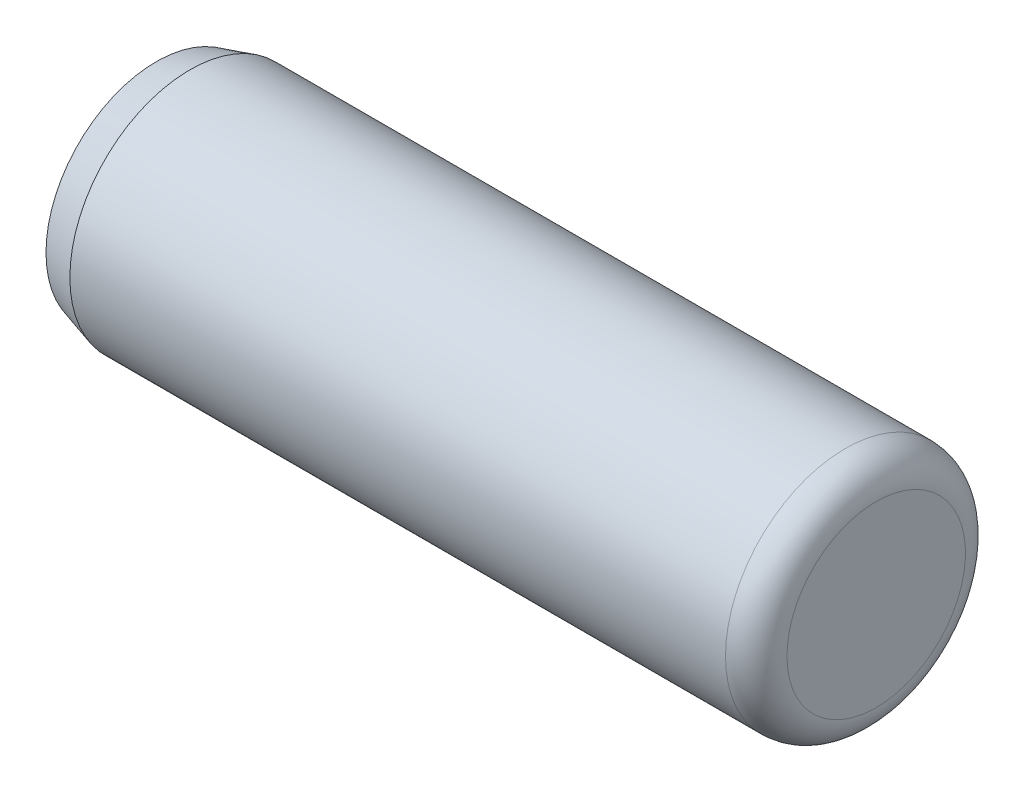
ISO-10303-21;
HEADER;
FILE_DESCRIPTION(('STEP AP214'),'2;1');
FILE_NAME('part.step','',(''),(''),'','','');
FILE_SCHEMA(('AUTOMOTIVE_DESIGN { 1 0 10303 214 1 1 1 1 }'));
ENDSEC;
DATA;
#1=APPLICATION_CONTEXT('core data for automotive mechanical design processes');
#2=APPLICATION_PROTOCOL_DEFINITION('international standard','automotive_design',2000,#1);
#3=PRODUCT_CONTEXT('',#1,'mechanical');
#4=PRODUCT('Part','Part','',(#3));
#5=PRODUCT_RELATED_PRODUCT_CATEGORY('part','',(#4));
#6=PRODUCT_DEFINITION_FORMATION('','',#4);
#7=PRODUCT_DEFINITION_CONTEXT('part definition',#1,'design');
#8=PRODUCT_DEFINITION('design','',#6,#7);
#9=PRODUCT_DEFINITION_SHAPE('','',#8);
#10=(LENGTH_UNIT() NAMED_UNIT(*) SI_UNIT(.MILLI.,.METRE.));
#11=(NAMED_UNIT(*) PLANE_ANGLE_UNIT() SI_UNIT($,.RADIAN.));
#12=(NAMED_UNIT(*) SI_UNIT($,.STERADIAN.) SOLID_ANGLE_UNIT());
#13=UNCERTAINTY_MEASURE_WITH_UNIT(LENGTH_MEASURE(1.E-05),#10,'distance_accuracy_value','');
#14=(GEOMETRIC_REPRESENTATION_CONTEXT(3) GLOBAL_UNCERTAINTY_ASSIGNED_CONTEXT((#13)) GLOBAL_UNIT_ASSIGNED_CONTEXT((#10,
#11,#12)) REPRESENTATION_CONTEXT('',''));
#15=CARTESIAN_POINT('',(0.,0.,0.));
#16=DIRECTION('',(0.,0.,1.));
#17=DIRECTION('',(1.,0.,0.));
#18=AXIS2_PLACEMENT_3D('',#15,#16,#17);
#19=CARTESIAN_POINT('',(4.3561,0.,0.));
#20=DIRECTION('',(-1.,0.,0.));
#21=DIRECTION('',(0.,0.,1.));
#22=AXIS2_PLACEMENT_3D('',#19,#20,#21);
#23=TOROIDAL_SURFACE('',#22,1.1811,0.406400000000001);
#24=CARTESIAN_POINT('',(4.3561,0.,0.));
#25=DIRECTION('',(-1.,0.,0.));
#26=DIRECTION('',(0.,0.,1.));
#27=AXIS2_PLACEMENT_3D('',#24,#25,#26);
#28=CIRCLE('',#27,1.5875);
#29=CARTESIAN_POINT('',(4.3561,0.,1.5875));
#30=VERTEX_POINT('',#29);
#31=EDGE_CURVE('E10',#30,#30,#28,.T.);
#32=ORIENTED_EDGE('',*,*,#31,.F.);
#33=EDGE_LOOP('',(#32));
#34=FACE_BOUND('',#33,.T.);
#35=CARTESIAN_POINT('',(4.7625,0.,0.));
#36=DIRECTION('',(-1.,0.,0.));
#37=DIRECTION('',(0.,0.,1.));
#38=AXIS2_PLACEMENT_3D('',#35,#36,#37);
#39=CIRCLE('',#38,1.1811);
#40=CARTESIAN_POINT('',(4.7625,0.,1.1811));
#41=VERTEX_POINT('',#40);
#42=EDGE_CURVE('E51',#41,#41,#39,.T.);
#43=ORIENTED_EDGE('',*,*,#42,.T.);
#44=EDGE_LOOP('',(#43));
#45=FACE_BOUND('',#44,.T.);
#46=ADVANCED_FACE('F37',(#34,#45),#23,.T.);
#47=CARTESIAN_POINT('',(-4.7625,0.,0.));
#48=DIRECTION('',(-1.,0.,0.));
#49=DIRECTION('',(0.,0.,1.));
#50=AXIS2_PLACEMENT_3D('',#47,#48,#49);
#51=CYLINDRICAL_SURFACE('',#50,1.5875);
#52=CARTESIAN_POINT('',(-4.31959836563221,0.,0.));
#53=DIRECTION('',(-1.,0.,0.));
#54=DIRECTION('',(0.,0.,1.));
#55=AXIS2_PLACEMENT_3D('',#52,#53,#54);
#56=CIRCLE('',#55,1.5875);
#57=CARTESIAN_POINT('',(-4.31959836563221,0.,1.5875));
#58=VERTEX_POINT('',#57);
#59=EDGE_CURVE('E43',#58,#58,#56,.T.);
#60=ORIENTED_EDGE('',*,*,#59,.F.);
#61=EDGE_LOOP('',(#60));
#62=FACE_BOUND('',#61,.T.);
#63=ORIENTED_EDGE('',*,*,#31,.T.);
#64=EDGE_LOOP('',(#63));
#65=FACE_BOUND('',#64,.T.);
#66=ADVANCED_FACE('F69',(#62,#65),#51,.T.);
#67=CARTESIAN_POINT('',(-4.31959836563221,0.,0.));
#68=DIRECTION('',(1.,0.,0.));
#69=DIRECTION('',(0.,0.,-1.));
#70=AXIS2_PLACEMENT_3D('',#67,#68,#69);
#71=CONICAL_SURFACE('',#70,1.5875,0.279252680319095);
#72=CARTESIAN_POINT('',(-4.7625,0.,0.));
#73=DIRECTION('',(-1.,0.,0.));
#74=DIRECTION('',(0.,0.,1.));
#75=AXIS2_PLACEMENT_3D('',#72,#73,#74);
#76=CIRCLE('',#75,1.4605);
#77=CARTESIAN_POINT('',(-4.7625,0.,1.4605));
#78=VERTEX_POINT('',#77);
#79=EDGE_CURVE('E47',#78,#78,#76,.T.);
#80=ORIENTED_EDGE('',*,*,#79,.F.);
#81=EDGE_LOOP('',(#80));
#82=FACE_BOUND('',#81,.T.);
#83=ORIENTED_EDGE('',*,*,#59,.T.);
#84=EDGE_LOOP('',(#83));
#85=FACE_BOUND('',#84,.T.);
#86=ADVANCED_FACE('F65',(#82,#85),#71,.T.);
#87=CARTESIAN_POINT('',(-4.7625,1.4605,0.));
#88=DIRECTION('',(1.,0.,0.));
#89=DIRECTION('',(0.,0.,-1.));
#90=AXIS2_PLACEMENT_3D('',#87,#88,#89);
#91=PLANE('',#90);
#92=ORIENTED_EDGE('',*,*,#79,.T.);
#93=EDGE_LOOP('',(#92));
#94=FACE_BOUND('',#93,.T.);
#95=ADVANCED_FACE('F60',(#94),#91,.F.);
#96=CARTESIAN_POINT('',(4.7625,1.1811,0.));
#97=DIRECTION('',(-1.,0.,0.));
#98=DIRECTION('',(0.,0.,1.));
#99=AXIS2_PLACEMENT_3D('',#96,#97,#98);
#100=PLANE('',#99);
#101=ORIENTED_EDGE('',*,*,#42,.F.);
#102=EDGE_LOOP('',(#101));
#103=FACE_BOUND('',#102,.T.);
#104=ADVANCED_FACE('F58',(#103),#100,.F.);
#105=CLOSED_SHELL('',(#46,#66,#86,#95,#104));
#106=MANIFOLD_SOLID_BREP('B2',#105);
#107=ADVANCED_BREP_SHAPE_REPRESENTATION('',(#18,#106),#14);
#108=SHAPE_DEFINITION_REPRESENTATION(#9,#107);
ENDSEC;
END-ISO-10303-21;
